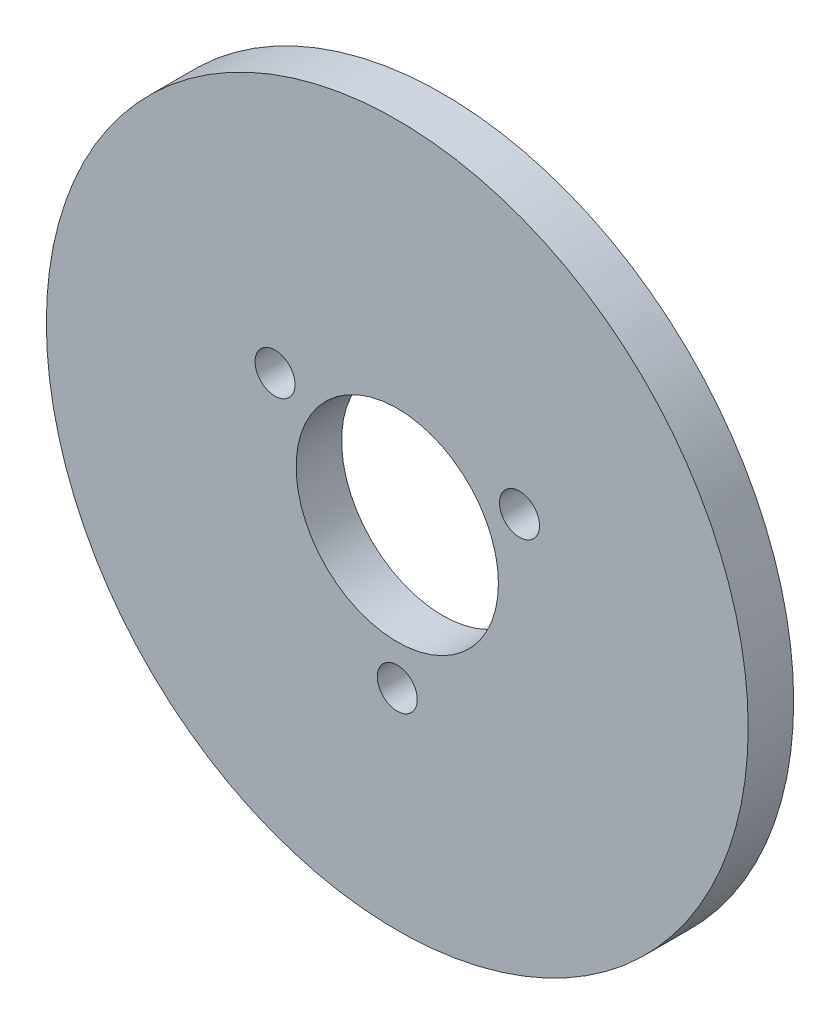
ISO-10303-21;
HEADER;
FILE_DESCRIPTION(('STEP AP214'),'2;1');
FILE_NAME('part.step','',(''),(''),'','','');
FILE_SCHEMA(('AUTOMOTIVE_DESIGN { 1 0 10303 214 1 1 1 1 }'));
ENDSEC;
DATA;
#1=APPLICATION_CONTEXT('core data for automotive mechanical design processes');
#2=APPLICATION_PROTOCOL_DEFINITION('international standard','automotive_design',2000,#1);
#3=PRODUCT_CONTEXT('',#1,'mechanical');
#4=PRODUCT('Part','Part','',(#3));
#5=PRODUCT_RELATED_PRODUCT_CATEGORY('part','',(#4));
#6=PRODUCT_DEFINITION_FORMATION('','',#4);
#7=PRODUCT_DEFINITION_CONTEXT('part definition',#1,'design');
#8=PRODUCT_DEFINITION('design','',#6,#7);
#9=PRODUCT_DEFINITION_SHAPE('','',#8);
#10=(LENGTH_UNIT() NAMED_UNIT(*) SI_UNIT(.MILLI.,.METRE.));
#11=(NAMED_UNIT(*) PLANE_ANGLE_UNIT() SI_UNIT($,.RADIAN.));
#12=(NAMED_UNIT(*) SI_UNIT($,.STERADIAN.) SOLID_ANGLE_UNIT());
#13=UNCERTAINTY_MEASURE_WITH_UNIT(LENGTH_MEASURE(1.E-05),#10,'distance_accuracy_value','');
#14=(GEOMETRIC_REPRESENTATION_CONTEXT(3) GLOBAL_UNCERTAINTY_ASSIGNED_CONTEXT((#13)) GLOBAL_UNIT_ASSIGNED_CONTEXT((#10,
#11,#12)) REPRESENTATION_CONTEXT('',''));
#15=CARTESIAN_POINT('',(0.,0.,0.));
#16=DIRECTION('',(0.,0.,1.));
#17=DIRECTION('',(1.,0.,0.));
#18=AXIS2_PLACEMENT_3D('',#15,#16,#17);
#19=CARTESIAN_POINT('',(0.,0.,2.9));
#20=DIRECTION('',(0.,0.,1.));
#21=DIRECTION('',(1.,0.,0.));
#22=AXIS2_PLACEMENT_3D('',#19,#20,#21);
#23=PLANE('',#22);
#24=CARTESIAN_POINT('',(7.79422863405995,4.5,2.9));
#25=DIRECTION('',(0.,0.,-1.));
#26=DIRECTION('',(-1.,0.,0.));
#27=AXIS2_PLACEMENT_3D('',#24,#25,#26);
#28=CIRCLE('',#27,1.27500000000001);
#29=CARTESIAN_POINT('',(6.51922863405994,4.5,2.9));
#30=VERTEX_POINT('',#29);
#31=EDGE_CURVE('E53',#30,#30,#28,.T.);
#32=ORIENTED_EDGE('',*,*,#31,.T.);
#33=EDGE_LOOP('',(#32));
#34=FACE_BOUND('',#33,.T.);
#35=CARTESIAN_POINT('',(0.,-9.,2.9));
#36=DIRECTION('',(0.,0.,-1.));
#37=DIRECTION('',(-1.,0.,0.));
#38=AXIS2_PLACEMENT_3D('',#35,#36,#37);
#39=CIRCLE('',#38,1.27500000000001);
#40=CARTESIAN_POINT('',(-1.27500000000001,-9.,2.9));
#41=VERTEX_POINT('',#40);
#42=EDGE_CURVE('E59',#41,#41,#39,.T.);
#43=ORIENTED_EDGE('',*,*,#42,.T.);
#44=EDGE_LOOP('',(#43));
#45=FACE_BOUND('',#44,.T.);
#46=CARTESIAN_POINT('',(-7.79422863405995,4.5,2.9));
#47=DIRECTION('',(0.,0.,-1.));
#48=DIRECTION('',(-1.,0.,0.));
#49=AXIS2_PLACEMENT_3D('',#46,#47,#48);
#50=CIRCLE('',#49,1.275);
#51=CARTESIAN_POINT('',(-9.06922863405995,4.5,2.9));
#52=VERTEX_POINT('',#51);
#53=EDGE_CURVE('E47',#52,#52,#50,.T.);
#54=ORIENTED_EDGE('',*,*,#53,.T.);
#55=EDGE_LOOP('',(#54));
#56=FACE_BOUND('',#55,.T.);
#57=CARTESIAN_POINT('',(0.,0.,2.9));
#58=DIRECTION('',(0.,0.,1.));
#59=DIRECTION('',(1.,0.,0.));
#60=AXIS2_PLACEMENT_3D('',#57,#58,#59);
#61=CIRCLE('',#60,22.375);
#62=CARTESIAN_POINT('',(22.375,0.,2.9));
#63=VERTEX_POINT('',#62);
#64=EDGE_CURVE('E10',#63,#63,#61,.T.);
#65=ORIENTED_EDGE('',*,*,#64,.T.);
#66=EDGE_LOOP('',(#65));
#67=FACE_BOUND('',#66,.T.);
#68=CARTESIAN_POINT('',(0.,0.,2.9));
#69=DIRECTION('',(0.,0.,1.));
#70=DIRECTION('',(1.,0.,0.));
#71=AXIS2_PLACEMENT_3D('',#68,#69,#70);
#72=CIRCLE('',#71,6.45);
#73=CARTESIAN_POINT('',(6.45,0.,2.9));
#74=VERTEX_POINT('',#73);
#75=EDGE_CURVE('E42',#74,#74,#72,.T.);
#76=ORIENTED_EDGE('',*,*,#75,.F.);
#77=EDGE_LOOP('',(#76));
#78=FACE_BOUND('',#77,.T.);
#79=ADVANCED_FACE('F31',(#34,#45,#56,#67,#78),#23,.T.);
#80=CARTESIAN_POINT('',(0.,0.,0.));
#81=DIRECTION('',(0.,0.,1.));
#82=DIRECTION('',(1.,0.,0.));
#83=AXIS2_PLACEMENT_3D('',#80,#81,#82);
#84=PLANE('',#83);
#85=CARTESIAN_POINT('',(7.79422863405995,4.5,0.));
#86=DIRECTION('',(0.,0.,-1.));
#87=DIRECTION('',(-1.,0.,0.));
#88=AXIS2_PLACEMENT_3D('',#85,#86,#87);
#89=CIRCLE('',#88,1.27500000000001);
#90=CARTESIAN_POINT('',(6.51922863405994,4.5,0.));
#91=VERTEX_POINT('',#90);
#92=EDGE_CURVE('E62',#91,#91,#89,.T.);
#93=ORIENTED_EDGE('',*,*,#92,.F.);
#94=EDGE_LOOP('',(#93));
#95=FACE_BOUND('',#94,.T.);
#96=CARTESIAN_POINT('',(0.,-9.,0.));
#97=DIRECTION('',(0.,0.,-1.));
#98=DIRECTION('',(-1.,0.,0.));
#99=AXIS2_PLACEMENT_3D('',#96,#97,#98);
#100=CIRCLE('',#99,1.27500000000001);
#101=CARTESIAN_POINT('',(-1.27500000000001,-9.,0.));
#102=VERTEX_POINT('',#101);
#103=EDGE_CURVE('E56',#102,#102,#100,.T.);
#104=ORIENTED_EDGE('',*,*,#103,.F.);
#105=EDGE_LOOP('',(#104));
#106=FACE_BOUND('',#105,.T.);
#107=CARTESIAN_POINT('',(-7.79422863405995,4.5,0.));
#108=DIRECTION('',(0.,0.,-1.));
#109=DIRECTION('',(-1.,0.,0.));
#110=AXIS2_PLACEMENT_3D('',#107,#108,#109);
#111=CIRCLE('',#110,1.275);
#112=CARTESIAN_POINT('',(-9.06922863405995,4.5,0.));
#113=VERTEX_POINT('',#112);
#114=EDGE_CURVE('E50',#113,#113,#111,.T.);
#115=ORIENTED_EDGE('',*,*,#114,.F.);
#116=EDGE_LOOP('',(#115));
#117=FACE_BOUND('',#116,.T.);
#118=CARTESIAN_POINT('',(0.,0.,0.));
#119=DIRECTION('',(0.,0.,1.));
#120=DIRECTION('',(1.,0.,0.));
#121=AXIS2_PLACEMENT_3D('',#118,#119,#120);
#122=CIRCLE('',#121,22.375);
#123=CARTESIAN_POINT('',(22.375,0.,0.));
#124=VERTEX_POINT('',#123);
#125=EDGE_CURVE('E35',#124,#124,#122,.T.);
#126=ORIENTED_EDGE('',*,*,#125,.F.);
#127=EDGE_LOOP('',(#126));
#128=FACE_BOUND('',#127,.T.);
#129=CARTESIAN_POINT('',(0.,0.,0.));
#130=DIRECTION('',(0.,0.,1.));
#131=DIRECTION('',(1.,0.,0.));
#132=AXIS2_PLACEMENT_3D('',#129,#130,#131);
#133=CIRCLE('',#132,6.45);
#134=CARTESIAN_POINT('',(6.45,0.,0.));
#135=VERTEX_POINT('',#134);
#136=EDGE_CURVE('E44',#135,#135,#133,.T.);
#137=ORIENTED_EDGE('',*,*,#136,.T.);
#138=EDGE_LOOP('',(#137));
#139=FACE_BOUND('',#138,.T.);
#140=ADVANCED_FACE('F77',(#95,#106,#117,#128,#139),#84,.F.);
#141=CARTESIAN_POINT('',(0.,0.,2.9));
#142=DIRECTION('',(0.,0.,-1.));
#143=DIRECTION('',(-1.,0.,0.));
#144=AXIS2_PLACEMENT_3D('',#141,#142,#143);
#145=CYLINDRICAL_SURFACE('',#144,22.375);
#146=ORIENTED_EDGE('',*,*,#64,.F.);
#147=EDGE_LOOP('',(#146));
#148=FACE_BOUND('',#147,.T.);
#149=ORIENTED_EDGE('',*,*,#125,.T.);
#150=EDGE_LOOP('',(#149));
#151=FACE_BOUND('',#150,.T.);
#152=ADVANCED_FACE('F33',(#148,#151),#145,.T.);
#153=CARTESIAN_POINT('',(0.,0.,2.9));
#154=DIRECTION('',(0.,0.,-1.));
#155=DIRECTION('',(-1.,0.,0.));
#156=AXIS2_PLACEMENT_3D('',#153,#154,#155);
#157=CYLINDRICAL_SURFACE('',#156,6.45);
#158=ORIENTED_EDGE('',*,*,#75,.T.);
#159=EDGE_LOOP('',(#158));
#160=FACE_BOUND('',#159,.T.);
#161=ORIENTED_EDGE('',*,*,#136,.F.);
#162=EDGE_LOOP('',(#161));
#163=FACE_BOUND('',#162,.T.);
#164=ADVANCED_FACE('F88',(#160,#163),#157,.F.);
#165=CARTESIAN_POINT('',(-7.79422863405995,4.5,2.9));
#166=DIRECTION('',(0.,0.,-1.));
#167=DIRECTION('',(-1.,0.,0.));
#168=AXIS2_PLACEMENT_3D('',#165,#166,#167);
#169=CYLINDRICAL_SURFACE('',#168,1.275);
#170=ORIENTED_EDGE('',*,*,#53,.F.);
#171=EDGE_LOOP('',(#170));
#172=FACE_BOUND('',#171,.T.);
#173=ORIENTED_EDGE('',*,*,#114,.T.);
#174=EDGE_LOOP('',(#173));
#175=FACE_BOUND('',#174,.T.);
#176=ADVANCED_FACE('F90',(#172,#175),#169,.F.);
#177=CARTESIAN_POINT('',(0.,-9.,2.9));
#178=DIRECTION('',(0.,0.,-1.));
#179=DIRECTION('',(-1.,0.,0.));
#180=AXIS2_PLACEMENT_3D('',#177,#178,#179);
#181=CYLINDRICAL_SURFACE('',#180,1.27500000000001);
#182=ORIENTED_EDGE('',*,*,#42,.F.);
#183=EDGE_LOOP('',(#182));
#184=FACE_BOUND('',#183,.T.);
#185=ORIENTED_EDGE('',*,*,#103,.T.);
#186=EDGE_LOOP('',(#185));
#187=FACE_BOUND('',#186,.T.);
#188=ADVANCED_FACE('F73',(#184,#187),#181,.F.);
#189=CARTESIAN_POINT('',(7.79422863405995,4.5,2.9));
#190=DIRECTION('',(0.,0.,-1.));
#191=DIRECTION('',(-1.,0.,0.));
#192=AXIS2_PLACEMENT_3D('',#189,#190,#191);
#193=CYLINDRICAL_SURFACE('',#192,1.27500000000001);
#194=ORIENTED_EDGE('',*,*,#31,.F.);
#195=EDGE_LOOP('',(#194));
#196=FACE_BOUND('',#195,.T.);
#197=ORIENTED_EDGE('',*,*,#92,.T.);
#198=EDGE_LOOP('',(#197));
#199=FACE_BOUND('',#198,.T.);
#200=ADVANCED_FACE('F70',(#196,#199),#193,.F.);
#201=CLOSED_SHELL('',(#79,#140,#152,#164,#176,#188,#200));
#202=MANIFOLD_SOLID_BREP('B2',#201);
#203=ADVANCED_BREP_SHAPE_REPRESENTATION('',(#18,#202),#14);
#204=SHAPE_DEFINITION_REPRESENTATION(#9,#203);
ENDSEC;
END-ISO-10303-21;
